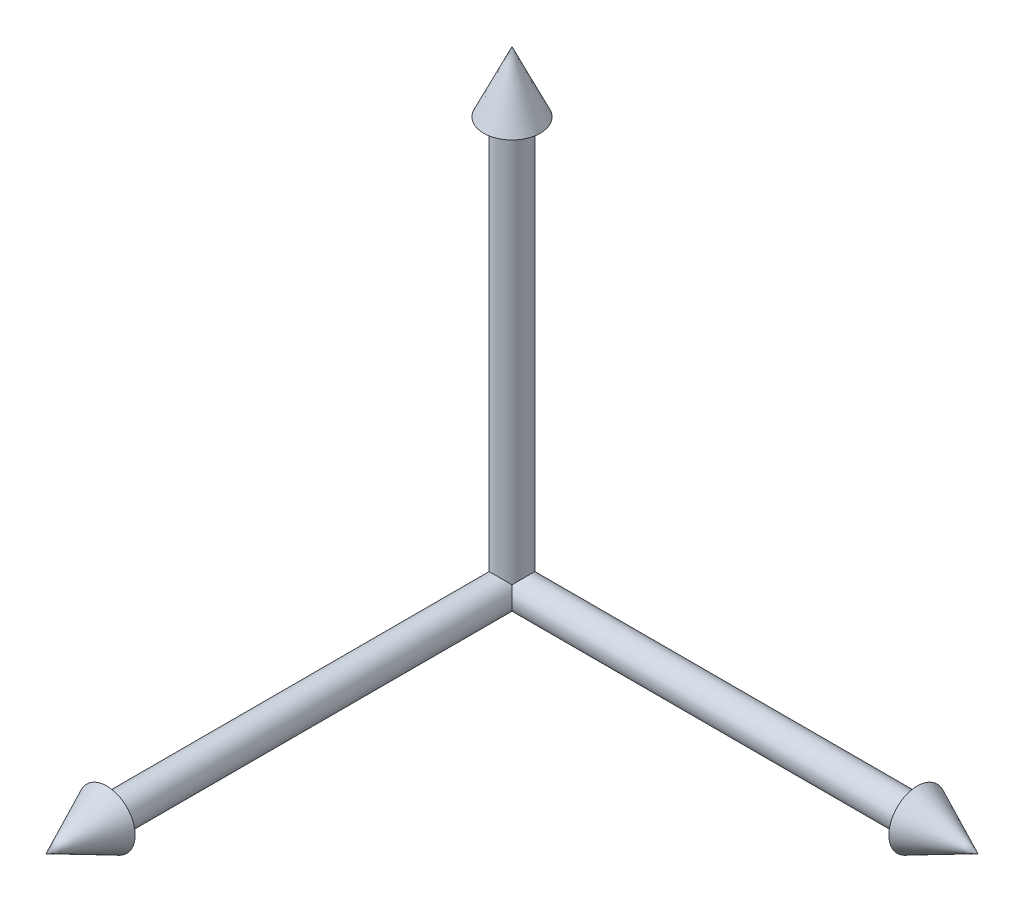
ISO-10303-21;
HEADER;
FILE_DESCRIPTION(('STEP AP214'),'2;1');
FILE_NAME('part.step','',(''),(''),'','','');
FILE_SCHEMA(('AUTOMOTIVE_DESIGN { 1 0 10303 214 1 1 1 1 }'));
ENDSEC;
DATA;
#1=APPLICATION_CONTEXT('core data for automotive mechanical design processes');
#2=APPLICATION_PROTOCOL_DEFINITION('international standard','automotive_design',2000,#1);
#3=PRODUCT_CONTEXT('',#1,'mechanical');
#4=PRODUCT('Part','Part','',(#3));
#5=PRODUCT_RELATED_PRODUCT_CATEGORY('part','',(#4));
#6=PRODUCT_DEFINITION_FORMATION('','',#4);
#7=PRODUCT_DEFINITION_CONTEXT('part definition',#1,'design');
#8=PRODUCT_DEFINITION('design','',#6,#7);
#9=PRODUCT_DEFINITION_SHAPE('','',#8);
#10=(LENGTH_UNIT() NAMED_UNIT(*) SI_UNIT(.MILLI.,.METRE.));
#11=(NAMED_UNIT(*) PLANE_ANGLE_UNIT() SI_UNIT($,.RADIAN.));
#12=(NAMED_UNIT(*) SI_UNIT($,.STERADIAN.) SOLID_ANGLE_UNIT());
#13=UNCERTAINTY_MEASURE_WITH_UNIT(LENGTH_MEASURE(1.E-05),#10,'distance_accuracy_value','');
#14=(GEOMETRIC_REPRESENTATION_CONTEXT(3) GLOBAL_UNCERTAINTY_ASSIGNED_CONTEXT((#13)) GLOBAL_UNIT_ASSIGNED_CONTEXT((#10,
#11,#12)) REPRESENTATION_CONTEXT('',''));
#15=CARTESIAN_POINT('',(0.,0.,0.));
#16=DIRECTION('',(0.,0.,1.));
#17=DIRECTION('',(1.,0.,0.));
#18=AXIS2_PLACEMENT_3D('',#15,#16,#17);
#19=CARTESIAN_POINT('',(0.,0.,10.));
#20=DIRECTION('',(0.,0.,-1.));
#21=DIRECTION('',(-1.,0.,0.));
#22=AXIS2_PLACEMENT_3D('',#19,#20,#21);
#23=CYLINDRICAL_SURFACE('',#22,0.4);
#24=CARTESIAN_POINT('',(0.,0.,10.));
#25=DIRECTION('',(0.,0.,1.));
#26=DIRECTION('',(1.,0.,0.));
#27=AXIS2_PLACEMENT_3D('',#24,#25,#26);
#28=CIRCLE('',#27,0.4);
#29=CARTESIAN_POINT('',(0.4,0.,10.));
#30=VERTEX_POINT('',#29);
#31=EDGE_CURVE('E108',#30,#30,#28,.T.);
#32=ORIENTED_EDGE('',*,*,#31,.F.);
#33=EDGE_LOOP('',(#32));
#34=FACE_BOUND('',#33,.T.);
#35=CARTESIAN_POINT('',(0.,0.,0.));
#36=DIRECTION('',(0.,0.707106781186546,-0.707106781186549));
#37=DIRECTION('',(0.,-0.707106781186549,-0.707106781186546));
#38=AXIS2_PLACEMENT_3D('',#35,#36,#37);
#39=ELLIPSE('',#38,0.565685424949237,0.4);
#40=CARTESIAN_POINT('',(-0.4,0.,0.));
#41=VERTEX_POINT('',#40);
#42=CARTESIAN_POINT('',(0.282842712474617,0.282842712474621,0.28284271247462));
#43=VERTEX_POINT('',#42);
#44=EDGE_CURVE('E58',#41,#43,#39,.T.);
#45=ORIENTED_EDGE('',*,*,#44,.F.);
#46=CARTESIAN_POINT('',(0.,0.,0.));
#47=DIRECTION('',(0.,0.,1.));
#48=DIRECTION('',(1.,0.,0.));
#49=AXIS2_PLACEMENT_3D('',#46,#47,#48);
#50=CIRCLE('',#49,0.4);
#51=CARTESIAN_POINT('',(0.,-0.4,0.));
#52=VERTEX_POINT('',#51);
#53=EDGE_CURVE('E110',#41,#52,#50,.T.);
#54=ORIENTED_EDGE('',*,*,#53,.T.);
#55=CARTESIAN_POINT('',(0.,0.,0.));
#56=DIRECTION('',(0.707106781186551,0.,-0.707106781186544));
#57=DIRECTION('',(-0.707106781186544,0.,-0.707106781186551));
#58=AXIS2_PLACEMENT_3D('',#55,#56,#57);
#59=ELLIPSE('',#58,0.565685424949241,0.4);
#60=EDGE_CURVE('E117',#43,#52,#59,.T.);
#61=ORIENTED_EDGE('',*,*,#60,.F.);
#62=EDGE_LOOP('',(#45,#54,#61));
#63=FACE_BOUND('',#62,.T.);
#64=ADVANCED_FACE('F44',(#34,#63),#23,.T.);
#65=CARTESIAN_POINT('',(0.,0.,0.));
#66=DIRECTION('',(0.,0.,1.));
#67=DIRECTION('',(1.,0.,0.));
#68=AXIS2_PLACEMENT_3D('',#65,#66,#67);
#69=PLANE('',#68);
#70=DIRECTION('',(-1.,0.,0.));
#71=VECTOR('',#70,1.);
#72=CARTESIAN_POINT('',(0.,0.,0.));
#73=LINE('',#72,#71);
#74=CARTESIAN_POINT('',(0.,0.,0.));
#75=VERTEX_POINT('',#74);
#76=EDGE_CURVE('E166',#75,#41,#73,.T.);
#77=ORIENTED_EDGE('',*,*,#76,.F.);
#78=DIRECTION('',(0.,1.,0.));
#79=VECTOR('',#78,1.);
#80=CARTESIAN_POINT('',(0.,0.,0.));
#81=LINE('',#80,#79);
#82=EDGE_CURVE('E51',#52,#75,#81,.T.);
#83=ORIENTED_EDGE('',*,*,#82,.F.);
#84=ORIENTED_EDGE('',*,*,#53,.F.);
#85=EDGE_LOOP('',(#77,#83,#84));
#86=FACE_BOUND('',#85,.T.);
#87=ADVANCED_FACE('F99',(#86),#69,.F.);
#88=CARTESIAN_POINT('',(10.,0.,1.04744440165294E-13));
#89=DIRECTION('',(-1.,0.,0.));
#90=DIRECTION('',(0.,0.,1.));
#91=AXIS2_PLACEMENT_3D('',#88,#89,#90);
#92=CYLINDRICAL_SURFACE('',#91,0.4);
#93=CARTESIAN_POINT('',(10.,0.,1.04744440165294E-13));
#94=DIRECTION('',(1.,0.,0.));
#95=DIRECTION('',(0.,0.,-1.));
#96=AXIS2_PLACEMENT_3D('',#93,#94,#95);
#97=CIRCLE('',#96,0.4);
#98=CARTESIAN_POINT('',(10.,0.,-0.399999999999895));
#99=VERTEX_POINT('',#98);
#100=EDGE_CURVE('E119',#99,#99,#97,.T.);
#101=ORIENTED_EDGE('',*,*,#100,.F.);
#102=EDGE_LOOP('',(#101));
#103=FACE_BOUND('',#102,.T.);
#104=CARTESIAN_POINT('',(0.,0.,0.));
#105=DIRECTION('',(-0.707106781186547,0.707106781186547,0.));
#106=DIRECTION('',(-0.707106781186547,-0.707106781186547,0.));
#107=AXIS2_PLACEMENT_3D('',#104,#105,#106);
#108=ELLIPSE('',#107,0.565685424949238,0.4);
#109=CARTESIAN_POINT('',(0.,0.,-0.4));
#110=VERTEX_POINT('',#109);
#111=EDGE_CURVE('E66',#43,#110,#108,.T.);
#112=ORIENTED_EDGE('',*,*,#111,.F.);
#113=ORIENTED_EDGE('',*,*,#60,.T.);
#114=CARTESIAN_POINT('',(0.,0.,0.));
#115=DIRECTION('',(1.,0.,0.));
#116=DIRECTION('',(0.,0.,-1.));
#117=AXIS2_PLACEMENT_3D('',#114,#115,#116);
#118=CIRCLE('',#117,0.4);
#119=EDGE_CURVE('E120',#52,#110,#118,.T.);
#120=ORIENTED_EDGE('',*,*,#119,.T.);
#121=EDGE_LOOP('',(#112,#113,#120));
#122=FACE_BOUND('',#121,.T.);
#123=ADVANCED_FACE('F104',(#103,#122),#92,.T.);
#124=CARTESIAN_POINT('',(0.,0.,0.));
#125=DIRECTION('',(1.,0.,0.));
#126=DIRECTION('',(0.,0.,-1.));
#127=AXIS2_PLACEMENT_3D('',#124,#125,#126);
#128=PLANE('',#127);
#129=DIRECTION('',(0.,0.,1.));
#130=VECTOR('',#129,1.);
#131=CARTESIAN_POINT('',(0.,0.,0.));
#132=LINE('',#131,#130);
#133=EDGE_CURVE('E12',#110,#75,#132,.T.);
#134=ORIENTED_EDGE('',*,*,#133,.F.);
#135=ORIENTED_EDGE('',*,*,#119,.F.);
#136=ORIENTED_EDGE('',*,*,#82,.T.);
#137=EDGE_LOOP('',(#134,#135,#136));
#138=FACE_BOUND('',#137,.T.);
#139=ADVANCED_FACE('F153',(#138),#128,.F.);
#140=CARTESIAN_POINT('',(0.,0.,10.));
#141=DIRECTION('',(0.,0.,1.));
#142=DIRECTION('',(1.,0.,0.));
#143=AXIS2_PLACEMENT_3D('',#140,#141,#142);
#144=PLANE('',#143);
#145=CARTESIAN_POINT('',(0.,0.,10.));
#146=DIRECTION('',(0.,0.,1.));
#147=DIRECTION('',(1.,0.,0.));
#148=AXIS2_PLACEMENT_3D('',#145,#146,#147);
#149=CIRCLE('',#148,0.7);
#150=CARTESIAN_POINT('',(0.7,0.,10.));
#151=VERTEX_POINT('',#150);
#152=EDGE_CURVE('E112',#151,#151,#149,.T.);
#153=ORIENTED_EDGE('',*,*,#152,.F.);
#154=EDGE_LOOP('',(#153));
#155=FACE_BOUND('',#154,.T.);
#156=ORIENTED_EDGE('',*,*,#31,.T.);
#157=EDGE_LOOP('',(#156));
#158=FACE_BOUND('',#157,.T.);
#159=ADVANCED_FACE('F210',(#155,#158),#144,.F.);
#160=CARTESIAN_POINT('',(0.,0.,11.5));
#161=DIRECTION('',(0.,0.,-1.));
#162=DIRECTION('',(-1.,0.,0.));
#163=AXIS2_PLACEMENT_3D('',#160,#161,#162);
#164=CONICAL_SURFACE('',#163,0.,0.436627159813541);
#165=ORIENTED_EDGE('',*,*,#152,.T.);
#166=EDGE_LOOP('',(#165));
#167=FACE_BOUND('',#166,.T.);
#168=CARTESIAN_POINT('',(0.,0.,11.5));
#169=VERTEX_POINT('',#168);
#170=VERTEX_LOOP('',#169);
#171=FACE_BOUND('',#170,.T.);
#172=ADVANCED_FACE('F146',(#167,#171),#164,.T.);
#173=CARTESIAN_POINT('',(10.,0.,1.04744440165294E-13));
#174=DIRECTION('',(1.,0.,0.));
#175=DIRECTION('',(0.,0.,-1.));
#176=AXIS2_PLACEMENT_3D('',#173,#174,#175);
#177=PLANE('',#176);
#178=CARTESIAN_POINT('',(10.,0.,1.04744440165294E-13));
#179=DIRECTION('',(1.,0.,0.));
#180=DIRECTION('',(0.,0.,-1.));
#181=AXIS2_PLACEMENT_3D('',#178,#179,#180);
#182=CIRCLE('',#181,0.7);
#183=CARTESIAN_POINT('',(10.,0.,-0.699999999999895));
#184=VERTEX_POINT('',#183);
#185=EDGE_CURVE('E122',#184,#184,#182,.T.);
#186=ORIENTED_EDGE('',*,*,#185,.F.);
#187=EDGE_LOOP('',(#186));
#188=FACE_BOUND('',#187,.T.);
#189=ORIENTED_EDGE('',*,*,#100,.T.);
#190=EDGE_LOOP('',(#189));
#191=FACE_BOUND('',#190,.T.);
#192=ADVANCED_FACE('F135',(#188,#191),#177,.F.);
#193=CARTESIAN_POINT('',(11.5,0.,1.20456106190088E-13));
#194=DIRECTION('',(-1.,0.,0.));
#195=DIRECTION('',(0.,0.,1.));
#196=AXIS2_PLACEMENT_3D('',#193,#194,#195);
#197=CONICAL_SURFACE('',#196,0.,0.436627159813541);
#198=ORIENTED_EDGE('',*,*,#185,.T.);
#199=EDGE_LOOP('',(#198));
#200=FACE_BOUND('',#199,.T.);
#201=CARTESIAN_POINT('',(11.5,0.,1.20456106190088E-13));
#202=VERTEX_POINT('',#201);
#203=VERTEX_LOOP('',#202);
#204=FACE_BOUND('',#203,.T.);
#205=ADVANCED_FACE('F145',(#200,#204),#197,.T.);
#206=CARTESIAN_POINT('',(0.,10.,0.));
#207=DIRECTION('',(0.,-1.,0.));
#208=DIRECTION('',(0.,0.,-1.));
#209=AXIS2_PLACEMENT_3D('',#206,#207,#208);
#210=CYLINDRICAL_SURFACE('',#209,0.4);
#211=CARTESIAN_POINT('',(0.,10.,0.));
#212=DIRECTION('',(0.,1.,0.));
#213=DIRECTION('',(1.,0.,0.));
#214=AXIS2_PLACEMENT_3D('',#211,#212,#213);
#215=CIRCLE('',#214,0.4);
#216=CARTESIAN_POINT('',(0.4,10.,0.));
#217=VERTEX_POINT('',#216);
#218=EDGE_CURVE('E169',#217,#217,#215,.T.);
#219=ORIENTED_EDGE('',*,*,#218,.F.);
#220=EDGE_LOOP('',(#219));
#221=FACE_BOUND('',#220,.T.);
#222=CARTESIAN_POINT('',(0.,0.,0.));
#223=DIRECTION('',(0.,1.,0.));
#224=DIRECTION('',(1.,0.,0.));
#225=AXIS2_PLACEMENT_3D('',#222,#223,#224);
#226=CIRCLE('',#225,0.4);
#227=EDGE_CURVE('E170',#110,#41,#226,.T.);
#228=ORIENTED_EDGE('',*,*,#227,.T.);
#229=ORIENTED_EDGE('',*,*,#44,.T.);
#230=ORIENTED_EDGE('',*,*,#111,.T.);
#231=EDGE_LOOP('',(#228,#229,#230));
#232=FACE_BOUND('',#231,.T.);
#233=ADVANCED_FACE('F148',(#221,#232),#210,.T.);
#234=CARTESIAN_POINT('',(0.,0.,0.));
#235=DIRECTION('',(0.,1.,0.));
#236=DIRECTION('',(1.,0.,0.));
#237=AXIS2_PLACEMENT_3D('',#234,#235,#236);
#238=PLANE('',#237);
#239=ORIENTED_EDGE('',*,*,#133,.T.);
#240=ORIENTED_EDGE('',*,*,#76,.T.);
#241=ORIENTED_EDGE('',*,*,#227,.F.);
#242=EDGE_LOOP('',(#239,#240,#241));
#243=FACE_BOUND('',#242,.T.);
#244=ADVANCED_FACE('F92',(#243),#238,.F.);
#245=CARTESIAN_POINT('',(0.,10.,0.));
#246=DIRECTION('',(0.,1.,0.));
#247=DIRECTION('',(1.,0.,0.));
#248=AXIS2_PLACEMENT_3D('',#245,#246,#247);
#249=PLANE('',#248);
#250=CARTESIAN_POINT('',(0.,10.,0.));
#251=DIRECTION('',(0.,1.,0.));
#252=DIRECTION('',(1.,0.,0.));
#253=AXIS2_PLACEMENT_3D('',#250,#251,#252);
#254=CIRCLE('',#253,0.7);
#255=CARTESIAN_POINT('',(0.7,10.,0.));
#256=VERTEX_POINT('',#255);
#257=EDGE_CURVE('E173',#256,#256,#254,.T.);
#258=ORIENTED_EDGE('',*,*,#257,.F.);
#259=EDGE_LOOP('',(#258));
#260=FACE_BOUND('',#259,.T.);
#261=ORIENTED_EDGE('',*,*,#218,.T.);
#262=EDGE_LOOP('',(#261));
#263=FACE_BOUND('',#262,.T.);
#264=ADVANCED_FACE('F86',(#260,#263),#249,.F.);
#265=CARTESIAN_POINT('',(0.,11.5,0.));
#266=DIRECTION('',(0.,-1.,0.));
#267=DIRECTION('',(-1.,0.,0.));
#268=AXIS2_PLACEMENT_3D('',#265,#266,#267);
#269=CONICAL_SURFACE('',#268,0.,0.436627159813541);
#270=ORIENTED_EDGE('',*,*,#257,.T.);
#271=EDGE_LOOP('',(#270));
#272=FACE_BOUND('',#271,.T.);
#273=CARTESIAN_POINT('',(0.,11.5,0.));
#274=VERTEX_POINT('',#273);
#275=VERTEX_LOOP('',#274);
#276=FACE_BOUND('',#275,.T.);
#277=ADVANCED_FACE('F84',(#272,#276),#269,.T.);
#278=CLOSED_SHELL('',(#64,#87,#123,#139,#159,#172,#192,#205,#233,#244,#264,#277));
#279=MANIFOLD_SOLID_BREP('B2',#278);
#280=ADVANCED_BREP_SHAPE_REPRESENTATION('',(#18,#279),#14);
#281=SHAPE_DEFINITION_REPRESENTATION(#9,#280);
ENDSEC;
END-ISO-10303-21;
